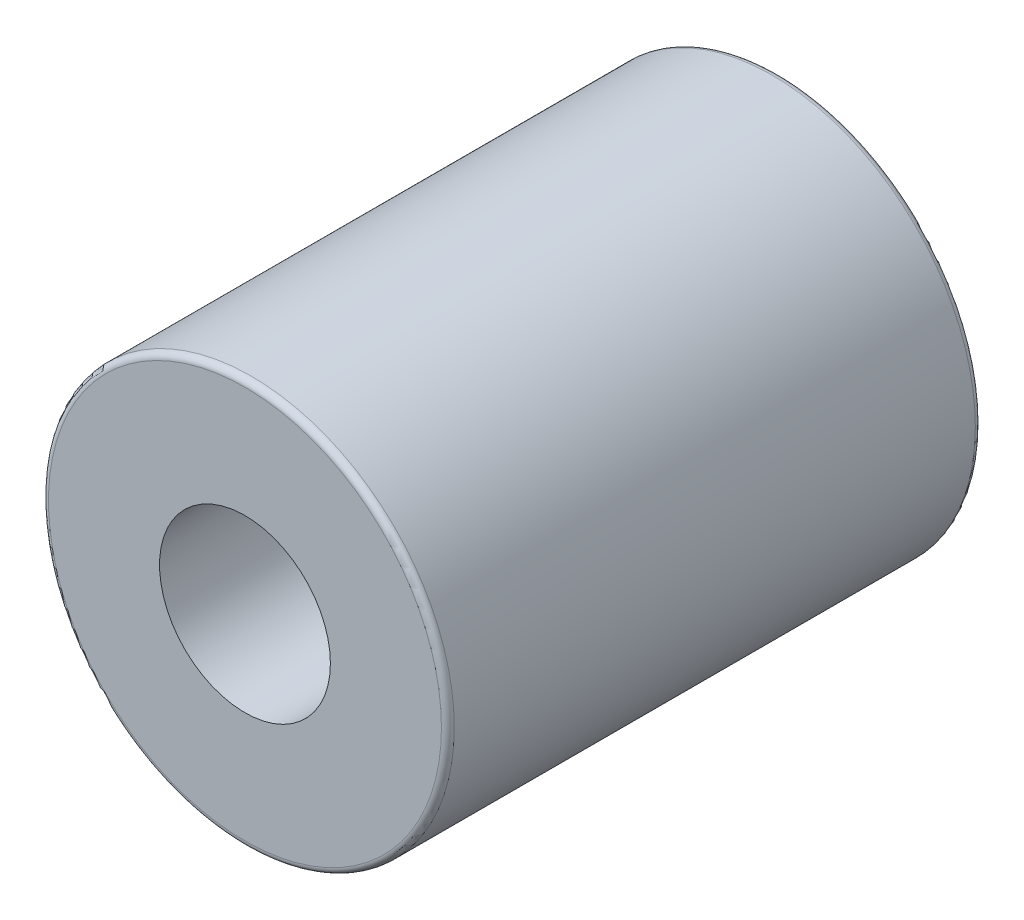
ISO-10303-21;
HEADER;
FILE_DESCRIPTION(('STEP AP214'),'2;1');
FILE_NAME('part.step','',(''),(''),'','','');
FILE_SCHEMA(('AUTOMOTIVE_DESIGN { 1 0 10303 214 1 1 1 1 }'));
ENDSEC;
DATA;
#1=APPLICATION_CONTEXT('core data for automotive mechanical design processes');
#2=APPLICATION_PROTOCOL_DEFINITION('international standard','automotive_design',2000,#1);
#3=PRODUCT_CONTEXT('',#1,'mechanical');
#4=PRODUCT('Part','Part','',(#3));
#5=PRODUCT_RELATED_PRODUCT_CATEGORY('part','',(#4));
#6=PRODUCT_DEFINITION_FORMATION('','',#4);
#7=PRODUCT_DEFINITION_CONTEXT('part definition',#1,'design');
#8=PRODUCT_DEFINITION('design','',#6,#7);
#9=PRODUCT_DEFINITION_SHAPE('','',#8);
#10=(LENGTH_UNIT() NAMED_UNIT(*) SI_UNIT(.MILLI.,.METRE.));
#11=(NAMED_UNIT(*) PLANE_ANGLE_UNIT() SI_UNIT($,.RADIAN.));
#12=(NAMED_UNIT(*) SI_UNIT($,.STERADIAN.) SOLID_ANGLE_UNIT());
#13=UNCERTAINTY_MEASURE_WITH_UNIT(LENGTH_MEASURE(1.E-05),#10,'distance_accuracy_value','');
#14=(GEOMETRIC_REPRESENTATION_CONTEXT(3) GLOBAL_UNCERTAINTY_ASSIGNED_CONTEXT((#13)) GLOBAL_UNIT_ASSIGNED_CONTEXT((#10,
#11,#12)) REPRESENTATION_CONTEXT('',''));
#15=CARTESIAN_POINT('',(0.,0.,0.));
#16=DIRECTION('',(0.,0.,1.));
#17=DIRECTION('',(1.,0.,0.));
#18=AXIS2_PLACEMENT_3D('',#15,#16,#17);
#19=CARTESIAN_POINT('',(0.,0.,25.));
#20=DIRECTION('',(0.,0.,-1.));
#21=DIRECTION('',(-1.,0.,0.));
#22=AXIS2_PLACEMENT_3D('',#19,#20,#21);
#23=CYLINDRICAL_SURFACE('',#22,2.5);
#24=CARTESIAN_POINT('',(0.,0.,0.));
#25=DIRECTION('',(0.,0.,1.));
#26=DIRECTION('',(1.,0.,0.));
#27=AXIS2_PLACEMENT_3D('',#24,#25,#26);
#28=CIRCLE('',#27,2.5);
#29=CARTESIAN_POINT('',(2.5,0.,0.));
#30=VERTEX_POINT('',#29);
#31=EDGE_CURVE('E61',#30,#30,#28,.T.);
#32=ORIENTED_EDGE('',*,*,#31,.F.);
#33=EDGE_LOOP('',(#32));
#34=FACE_BOUND('',#33,.T.);
#35=CARTESIAN_POINT('',(0.,0.,12.5));
#36=DIRECTION('',(0.,0.,1.));
#37=DIRECTION('',(1.,0.,0.));
#38=AXIS2_PLACEMENT_3D('',#35,#36,#37);
#39=CIRCLE('',#38,2.5);
#40=CARTESIAN_POINT('',(2.5,0.,12.5));
#41=VERTEX_POINT('',#40);
#42=EDGE_CURVE('E62',#41,#41,#39,.T.);
#43=ORIENTED_EDGE('',*,*,#42,.T.);
#44=EDGE_LOOP('',(#43));
#45=FACE_BOUND('',#44,.T.);
#46=ADVANCED_FACE('F37',(#34,#45),#23,.F.);
#47=CARTESIAN_POINT('',(0.,0.,25.));
#48=DIRECTION('',(0.,0.,1.));
#49=DIRECTION('',(1.,0.,0.));
#50=AXIS2_PLACEMENT_3D('',#47,#48,#49);
#51=PLANE('',#50);
#52=CARTESIAN_POINT('',(0.,0.,25.));
#53=DIRECTION('',(0.,0.,1.));
#54=DIRECTION('',(1.,0.,0.));
#55=AXIS2_PLACEMENT_3D('',#52,#53,#54);
#56=CIRCLE('',#55,9.2);
#57=CARTESIAN_POINT('',(9.2,0.,25.));
#58=VERTEX_POINT('',#57);
#59=EDGE_CURVE('E10',#58,#58,#56,.T.);
#60=ORIENTED_EDGE('',*,*,#59,.T.);
#61=EDGE_LOOP('',(#60));
#62=FACE_BOUND('',#61,.T.);
#63=CARTESIAN_POINT('',(0.,0.,25.));
#64=DIRECTION('',(0.,0.,1.));
#65=DIRECTION('',(1.,0.,0.));
#66=AXIS2_PLACEMENT_3D('',#63,#64,#65);
#67=CIRCLE('',#66,4.);
#68=CARTESIAN_POINT('',(4.,0.,25.));
#69=VERTEX_POINT('',#68);
#70=EDGE_CURVE('E70',#69,#69,#67,.T.);
#71=ORIENTED_EDGE('',*,*,#70,.F.);
#72=EDGE_LOOP('',(#71));
#73=FACE_BOUND('',#72,.T.);
#74=ADVANCED_FACE('F87',(#62,#73),#51,.T.);
#75=CARTESIAN_POINT('',(0.,0.,0.));
#76=DIRECTION('',(0.,0.,1.));
#77=DIRECTION('',(1.,0.,0.));
#78=AXIS2_PLACEMENT_3D('',#75,#76,#77);
#79=PLANE('',#78);
#80=CARTESIAN_POINT('',(0.,0.,0.));
#81=DIRECTION('',(0.,0.,1.));
#82=DIRECTION('',(1.,0.,0.));
#83=AXIS2_PLACEMENT_3D('',#80,#81,#82);
#84=CIRCLE('',#83,9.2);
#85=CARTESIAN_POINT('',(9.2,0.,0.));
#86=VERTEX_POINT('',#85);
#87=EDGE_CURVE('E45',#86,#86,#84,.F.);
#88=ORIENTED_EDGE('',*,*,#87,.T.);
#89=EDGE_LOOP('',(#88));
#90=FACE_BOUND('',#89,.T.);
#91=ORIENTED_EDGE('',*,*,#31,.T.);
#92=EDGE_LOOP('',(#91));
#93=FACE_BOUND('',#92,.T.);
#94=ADVANCED_FACE('F89',(#90,#93),#79,.F.);
#95=CARTESIAN_POINT('',(0.,0.,25.));
#96=DIRECTION('',(0.,0.,-1.));
#97=DIRECTION('',(-1.,0.,0.));
#98=AXIS2_PLACEMENT_3D('',#95,#96,#97);
#99=CYLINDRICAL_SURFACE('',#98,9.5);
#100=CARTESIAN_POINT('',(0.,0.,0.300000000000002));
#101=DIRECTION('',(0.,0.,1.));
#102=DIRECTION('',(1.,0.,0.));
#103=AXIS2_PLACEMENT_3D('',#100,#101,#102);
#104=CIRCLE('',#103,9.5);
#105=CARTESIAN_POINT('',(9.5,0.,0.300000000000002));
#106=VERTEX_POINT('',#105);
#107=EDGE_CURVE('E50',#106,#106,#104,.T.);
#108=ORIENTED_EDGE('',*,*,#107,.T.);
#109=EDGE_LOOP('',(#108));
#110=FACE_BOUND('',#109,.T.);
#111=CARTESIAN_POINT('',(0.,0.,24.7));
#112=DIRECTION('',(0.,0.,1.));
#113=DIRECTION('',(1.,0.,0.));
#114=AXIS2_PLACEMENT_3D('',#111,#112,#113);
#115=CIRCLE('',#114,9.5);
#116=CARTESIAN_POINT('',(9.5,0.,24.7));
#117=VERTEX_POINT('',#116);
#118=EDGE_CURVE('E55',#117,#117,#115,.F.);
#119=ORIENTED_EDGE('',*,*,#118,.T.);
#120=EDGE_LOOP('',(#119));
#121=FACE_BOUND('',#120,.T.);
#122=ADVANCED_FACE('F83',(#110,#121),#99,.T.);
#123=CARTESIAN_POINT('',(0.,0.,12.5));
#124=DIRECTION('',(0.,0.,1.));
#125=DIRECTION('',(1.,0.,0.));
#126=AXIS2_PLACEMENT_3D('',#123,#124,#125);
#127=CYLINDRICAL_SURFACE('',#126,4.);
#128=CARTESIAN_POINT('',(0.,0.,12.5));
#129=DIRECTION('',(0.,0.,1.));
#130=DIRECTION('',(1.,0.,0.));
#131=AXIS2_PLACEMENT_3D('',#128,#129,#130);
#132=CIRCLE('',#131,4.);
#133=CARTESIAN_POINT('',(4.,0.,12.5));
#134=VERTEX_POINT('',#133);
#135=EDGE_CURVE('E66',#134,#134,#132,.T.);
#136=ORIENTED_EDGE('',*,*,#135,.F.);
#137=EDGE_LOOP('',(#136));
#138=FACE_BOUND('',#137,.T.);
#139=ORIENTED_EDGE('',*,*,#70,.T.);
#140=EDGE_LOOP('',(#139));
#141=FACE_BOUND('',#140,.T.);
#142=ADVANCED_FACE('F80',(#138,#141),#127,.F.);
#143=CARTESIAN_POINT('',(0.,0.,12.5));
#144=DIRECTION('',(0.,0.,1.));
#145=DIRECTION('',(1.,0.,0.));
#146=AXIS2_PLACEMENT_3D('',#143,#144,#145);
#147=PLANE('',#146);
#148=ORIENTED_EDGE('',*,*,#42,.F.);
#149=EDGE_LOOP('',(#148));
#150=FACE_BOUND('',#149,.T.);
#151=ORIENTED_EDGE('',*,*,#135,.T.);
#152=EDGE_LOOP('',(#151));
#153=FACE_BOUND('',#152,.T.);
#154=ADVANCED_FACE('F78',(#150,#153),#147,.T.);
#155=CARTESIAN_POINT('',(0.,0.,0.300000000000002));
#156=DIRECTION('',(0.,0.,1.));
#157=DIRECTION('',(1.,0.,0.));
#158=AXIS2_PLACEMENT_3D('',#155,#156,#157);
#159=TOROIDAL_SURFACE('',#158,9.2,0.3);
#160=ORIENTED_EDGE('',*,*,#87,.F.);
#161=EDGE_LOOP('',(#160));
#162=FACE_BOUND('',#161,.T.);
#163=ORIENTED_EDGE('',*,*,#107,.F.);
#164=EDGE_LOOP('',(#163));
#165=FACE_BOUND('',#164,.T.);
#166=ADVANCED_FACE('F101',(#162,#165),#159,.T.);
#167=CARTESIAN_POINT('',(0.,0.,24.7));
#168=DIRECTION('',(0.,0.,1.));
#169=DIRECTION('',(1.,0.,0.));
#170=AXIS2_PLACEMENT_3D('',#167,#168,#169);
#171=TOROIDAL_SURFACE('',#170,9.2,0.3);
#172=ORIENTED_EDGE('',*,*,#118,.F.);
#173=EDGE_LOOP('',(#172));
#174=FACE_BOUND('',#173,.T.);
#175=ORIENTED_EDGE('',*,*,#59,.F.);
#176=EDGE_LOOP('',(#175));
#177=FACE_BOUND('',#176,.T.);
#178=ADVANCED_FACE('F39',(#174,#177),#171,.T.);
#179=CLOSED_SHELL('',(#46,#74,#94,#122,#142,#154,#166,#178));
#180=MANIFOLD_SOLID_BREP('B2',#179);
#181=ADVANCED_BREP_SHAPE_REPRESENTATION('',(#18,#180),#14);
#182=SHAPE_DEFINITION_REPRESENTATION(#9,#181);
ENDSEC;
END-ISO-10303-21;
